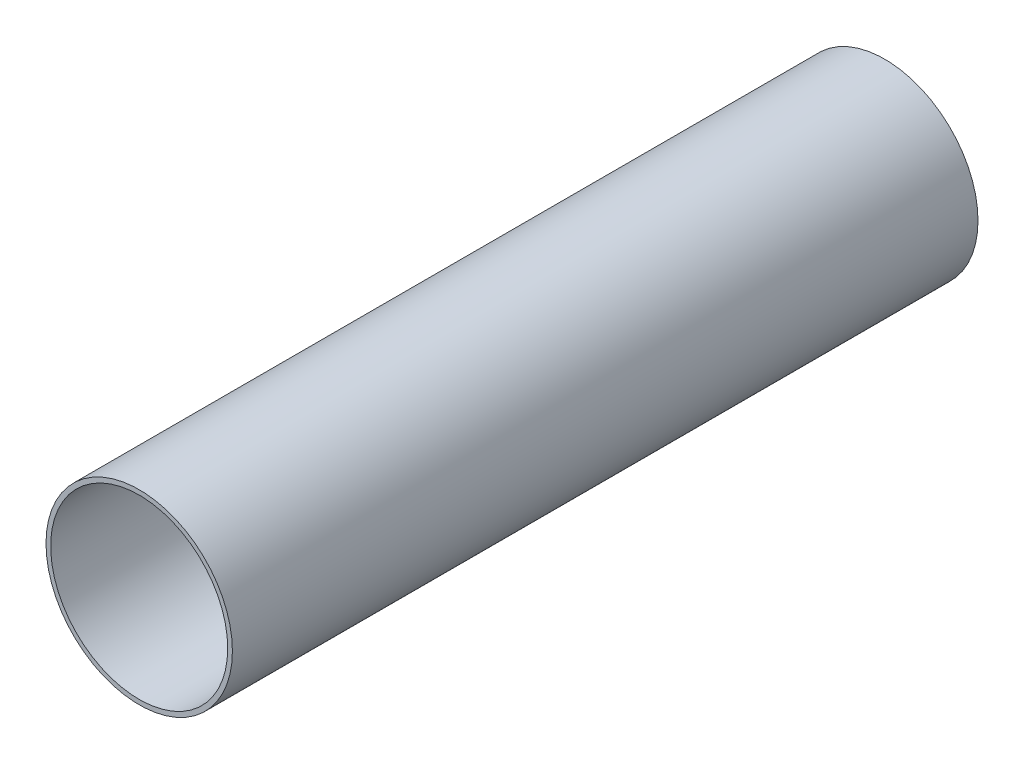
ISO-10303-21;
HEADER;
FILE_DESCRIPTION(('STEP AP214'),'2;1');
FILE_NAME('part.step','',(''),(''),'','','');
FILE_SCHEMA(('AUTOMOTIVE_DESIGN { 1 0 10303 214 1 1 1 1 }'));
ENDSEC;
DATA;
#1=APPLICATION_CONTEXT('core data for automotive mechanical design processes');
#2=APPLICATION_PROTOCOL_DEFINITION('international standard','automotive_design',2000,#1);
#3=PRODUCT_CONTEXT('',#1,'mechanical');
#4=PRODUCT('Part','Part','',(#3));
#5=PRODUCT_RELATED_PRODUCT_CATEGORY('part','',(#4));
#6=PRODUCT_DEFINITION_FORMATION('','',#4);
#7=PRODUCT_DEFINITION_CONTEXT('part definition',#1,'design');
#8=PRODUCT_DEFINITION('design','',#6,#7);
#9=PRODUCT_DEFINITION_SHAPE('','',#8);
#10=(LENGTH_UNIT() NAMED_UNIT(*) SI_UNIT(.MILLI.,.METRE.));
#11=(NAMED_UNIT(*) PLANE_ANGLE_UNIT() SI_UNIT($,.RADIAN.));
#12=(NAMED_UNIT(*) SI_UNIT($,.STERADIAN.) SOLID_ANGLE_UNIT());
#13=UNCERTAINTY_MEASURE_WITH_UNIT(LENGTH_MEASURE(1.E-05),#10,'distance_accuracy_value','');
#14=(GEOMETRIC_REPRESENTATION_CONTEXT(3) GLOBAL_UNCERTAINTY_ASSIGNED_CONTEXT((#13)) GLOBAL_UNIT_ASSIGNED_CONTEXT((#10,
#11,#12)) REPRESENTATION_CONTEXT('',''));
#15=CARTESIAN_POINT('',(0.,0.,0.));
#16=DIRECTION('',(0.,0.,1.));
#17=DIRECTION('',(1.,0.,0.));
#18=AXIS2_PLACEMENT_3D('',#15,#16,#17);
#19=CARTESIAN_POINT('',(0.,0.,-508.));
#20=DIRECTION('',(0.,0.,1.));
#21=DIRECTION('',(1.,0.,0.));
#22=AXIS2_PLACEMENT_3D('',#19,#20,#21);
#23=CYLINDRICAL_SURFACE('',#22,63.5);
#24=CARTESIAN_POINT('',(0.,0.,-508.));
#25=DIRECTION('',(0.,0.,1.));
#26=DIRECTION('',(1.,0.,0.));
#27=AXIS2_PLACEMENT_3D('',#24,#25,#26);
#28=CIRCLE('',#27,63.5);
#29=CARTESIAN_POINT('',(63.5,0.,-508.));
#30=VERTEX_POINT('',#29);
#31=EDGE_CURVE('E10',#30,#30,#28,.T.);
#32=ORIENTED_EDGE('',*,*,#31,.T.);
#33=EDGE_LOOP('',(#32));
#34=FACE_BOUND('',#33,.T.);
#35=CARTESIAN_POINT('',(0.,0.,0.));
#36=DIRECTION('',(0.,0.,1.));
#37=DIRECTION('',(1.,0.,0.));
#38=AXIS2_PLACEMENT_3D('',#35,#36,#37);
#39=CIRCLE('',#38,63.5);
#40=CARTESIAN_POINT('',(63.5,0.,0.));
#41=VERTEX_POINT('',#40);
#42=EDGE_CURVE('E34',#41,#41,#39,.T.);
#43=ORIENTED_EDGE('',*,*,#42,.F.);
#44=EDGE_LOOP('',(#43));
#45=FACE_BOUND('',#44,.T.);
#46=ADVANCED_FACE('F31',(#34,#45),#23,.T.);
#47=CARTESIAN_POINT('',(0.,0.,-508.));
#48=DIRECTION('',(0.,0.,1.));
#49=DIRECTION('',(1.,0.,0.));
#50=AXIS2_PLACEMENT_3D('',#47,#48,#49);
#51=PLANE('',#50);
#52=CARTESIAN_POINT('',(0.,0.,-508.));
#53=DIRECTION('',(0.,0.,1.));
#54=DIRECTION('',(1.,0.,0.));
#55=AXIS2_PLACEMENT_3D('',#52,#53,#54);
#56=CIRCLE('',#55,60.325);
#57=CARTESIAN_POINT('',(60.325,0.,-508.));
#58=VERTEX_POINT('',#57);
#59=EDGE_CURVE('E41',#58,#58,#56,.T.);
#60=ORIENTED_EDGE('',*,*,#59,.T.);
#61=EDGE_LOOP('',(#60));
#62=FACE_BOUND('',#61,.T.);
#63=ORIENTED_EDGE('',*,*,#31,.F.);
#64=EDGE_LOOP('',(#63));
#65=FACE_BOUND('',#64,.T.);
#66=ADVANCED_FACE('F49',(#62,#65),#51,.F.);
#67=CARTESIAN_POINT('',(0.,0.,0.));
#68=DIRECTION('',(0.,0.,1.));
#69=DIRECTION('',(1.,0.,0.));
#70=AXIS2_PLACEMENT_3D('',#67,#68,#69);
#71=PLANE('',#70);
#72=CARTESIAN_POINT('',(0.,0.,0.));
#73=DIRECTION('',(0.,0.,1.));
#74=DIRECTION('',(1.,0.,0.));
#75=AXIS2_PLACEMENT_3D('',#72,#73,#74);
#76=CIRCLE('',#75,60.325);
#77=CARTESIAN_POINT('',(60.325,0.,0.));
#78=VERTEX_POINT('',#77);
#79=EDGE_CURVE('E43',#78,#78,#76,.T.);
#80=ORIENTED_EDGE('',*,*,#79,.F.);
#81=EDGE_LOOP('',(#80));
#82=FACE_BOUND('',#81,.T.);
#83=ORIENTED_EDGE('',*,*,#42,.T.);
#84=EDGE_LOOP('',(#83));
#85=FACE_BOUND('',#84,.T.);
#86=ADVANCED_FACE('F55',(#82,#85),#71,.T.);
#87=CARTESIAN_POINT('',(0.,0.,-508.));
#88=DIRECTION('',(0.,0.,1.));
#89=DIRECTION('',(1.,0.,0.));
#90=AXIS2_PLACEMENT_3D('',#87,#88,#89);
#91=CYLINDRICAL_SURFACE('',#90,60.325);
#92=ORIENTED_EDGE('',*,*,#59,.F.);
#93=EDGE_LOOP('',(#92));
#94=FACE_BOUND('',#93,.T.);
#95=ORIENTED_EDGE('',*,*,#79,.T.);
#96=EDGE_LOOP('',(#95));
#97=FACE_BOUND('',#96,.T.);
#98=ADVANCED_FACE('F52',(#94,#97),#91,.F.);
#99=CLOSED_SHELL('',(#46,#66,#86,#98));
#100=MANIFOLD_SOLID_BREP('B2',#99);
#101=ADVANCED_BREP_SHAPE_REPRESENTATION('',(#18,#100),#14);
#102=SHAPE_DEFINITION_REPRESENTATION(#9,#101);
ENDSEC;
END-ISO-10303-21;
